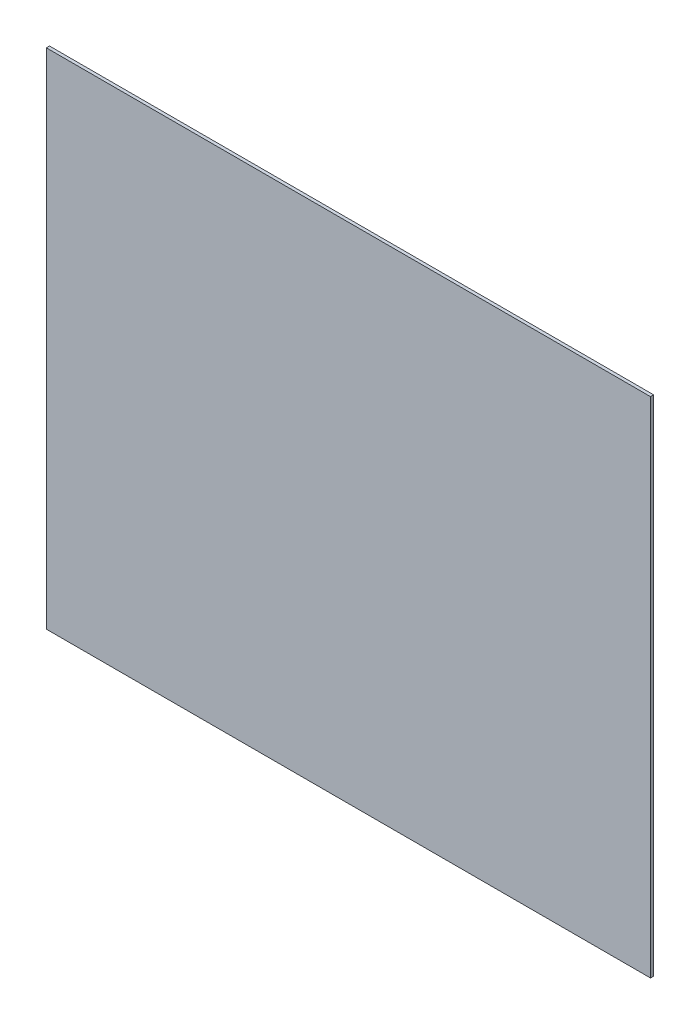
ISO-10303-21;
HEADER;
FILE_DESCRIPTION(('STEP AP214'),'2;1');
FILE_NAME('part.step','',(''),(''),'','','');
FILE_SCHEMA(('AUTOMOTIVE_DESIGN { 1 0 10303 214 1 1 1 1 }'));
ENDSEC;
DATA;
#1=APPLICATION_CONTEXT('core data for automotive mechanical design processes');
#2=APPLICATION_PROTOCOL_DEFINITION('international standard','automotive_design',2000,#1);
#3=PRODUCT_CONTEXT('',#1,'mechanical');
#4=PRODUCT('Part','Part','',(#3));
#5=PRODUCT_RELATED_PRODUCT_CATEGORY('part','',(#4));
#6=PRODUCT_DEFINITION_FORMATION('','',#4);
#7=PRODUCT_DEFINITION_CONTEXT('part definition',#1,'design');
#8=PRODUCT_DEFINITION('design','',#6,#7);
#9=PRODUCT_DEFINITION_SHAPE('','',#8);
#10=(LENGTH_UNIT() NAMED_UNIT(*) SI_UNIT(.MILLI.,.METRE.));
#11=(NAMED_UNIT(*) PLANE_ANGLE_UNIT() SI_UNIT($,.RADIAN.));
#12=(NAMED_UNIT(*) SI_UNIT($,.STERADIAN.) SOLID_ANGLE_UNIT());
#13=UNCERTAINTY_MEASURE_WITH_UNIT(LENGTH_MEASURE(1.E-05),#10,'distance_accuracy_value','');
#14=(GEOMETRIC_REPRESENTATION_CONTEXT(3) GLOBAL_UNCERTAINTY_ASSIGNED_CONTEXT((#13)) GLOBAL_UNIT_ASSIGNED_CONTEXT((#10,
#11,#12)) REPRESENTATION_CONTEXT('',''));
#15=CARTESIAN_POINT('',(0.,0.,0.));
#16=DIRECTION('',(0.,0.,1.));
#17=DIRECTION('',(1.,0.,0.));
#18=AXIS2_PLACEMENT_3D('',#15,#16,#17);
#19=CARTESIAN_POINT('',(304.8,-254.,3.175));
#20=DIRECTION('',(-1.,0.,0.));
#21=DIRECTION('',(0.,0.,1.));
#22=AXIS2_PLACEMENT_3D('',#19,#20,#21);
#23=PLANE('',#22);
#24=DIRECTION('',(0.,1.,0.));
#25=VECTOR('',#24,1.);
#26=CARTESIAN_POINT('',(304.8,-254.,0.));
#27=LINE('',#26,#25);
#28=CARTESIAN_POINT('',(304.8,-254.,0.));
#29=VERTEX_POINT('',#28);
#30=CARTESIAN_POINT('',(304.8,254.,0.));
#31=VERTEX_POINT('',#30);
#32=EDGE_CURVE('E104',#29,#31,#27,.T.);
#33=ORIENTED_EDGE('',*,*,#32,.T.);
#34=DIRECTION('',(0.,0.,-1.));
#35=VECTOR('',#34,1.);
#36=CARTESIAN_POINT('',(304.8,254.,3.175));
#37=LINE('',#36,#35);
#38=CARTESIAN_POINT('',(304.8,254.,3.175));
#39=VERTEX_POINT('',#38);
#40=EDGE_CURVE('E11',#39,#31,#37,.T.);
#41=ORIENTED_EDGE('',*,*,#40,.F.);
#42=DIRECTION('',(0.,1.,0.));
#43=VECTOR('',#42,1.);
#44=CARTESIAN_POINT('',(304.8,-254.,3.175));
#45=LINE('',#44,#43);
#46=CARTESIAN_POINT('',(304.8,-254.,3.175));
#47=VERTEX_POINT('',#46);
#48=EDGE_CURVE('E92',#47,#39,#45,.T.);
#49=ORIENTED_EDGE('',*,*,#48,.F.);
#50=DIRECTION('',(0.,0.,-1.));
#51=VECTOR('',#50,1.);
#52=CARTESIAN_POINT('',(304.8,-254.,3.175));
#53=LINE('',#52,#51);
#54=EDGE_CURVE('E100',#47,#29,#53,.T.);
#55=ORIENTED_EDGE('',*,*,#54,.T.);
#56=EDGE_LOOP('',(#33,#41,#49,#55));
#57=FACE_BOUND('',#56,.T.);
#58=ADVANCED_FACE('F41',(#57),#23,.F.);
#59=CARTESIAN_POINT('',(-304.8,254.,3.175));
#60=DIRECTION('',(0.,-1.,0.));
#61=DIRECTION('',(0.,0.,-1.));
#62=AXIS2_PLACEMENT_3D('',#59,#60,#61);
#63=PLANE('',#62);
#64=DIRECTION('',(-1.,0.,0.));
#65=VECTOR('',#64,1.);
#66=CARTESIAN_POINT('',(-304.8,254.,0.));
#67=LINE('',#66,#65);
#68=CARTESIAN_POINT('',(-304.8,254.,0.));
#69=VERTEX_POINT('',#68);
#70=EDGE_CURVE('E96',#31,#69,#67,.T.);
#71=ORIENTED_EDGE('',*,*,#70,.T.);
#72=DIRECTION('',(0.,0.,-1.));
#73=VECTOR('',#72,1.);
#74=CARTESIAN_POINT('',(-304.8,254.,3.175));
#75=LINE('',#74,#73);
#76=CARTESIAN_POINT('',(-304.8,254.,3.175));
#77=VERTEX_POINT('',#76);
#78=EDGE_CURVE('E49',#77,#69,#75,.T.);
#79=ORIENTED_EDGE('',*,*,#78,.F.);
#80=DIRECTION('',(-1.,0.,0.));
#81=VECTOR('',#80,1.);
#82=CARTESIAN_POINT('',(-304.8,254.,3.175));
#83=LINE('',#82,#81);
#84=EDGE_CURVE('E87',#39,#77,#83,.T.);
#85=ORIENTED_EDGE('',*,*,#84,.F.);
#86=ORIENTED_EDGE('',*,*,#40,.T.);
#87=EDGE_LOOP('',(#71,#79,#85,#86));
#88=FACE_BOUND('',#87,.T.);
#89=ADVANCED_FACE('F95',(#88),#63,.F.);
#90=CARTESIAN_POINT('',(-304.8,-254.,3.175));
#91=DIRECTION('',(1.,0.,0.));
#92=DIRECTION('',(0.,0.,-1.));
#93=AXIS2_PLACEMENT_3D('',#90,#91,#92);
#94=PLANE('',#93);
#95=DIRECTION('',(0.,-1.,0.));
#96=VECTOR('',#95,1.);
#97=CARTESIAN_POINT('',(-304.8,-254.,0.));
#98=LINE('',#97,#96);
#99=CARTESIAN_POINT('',(-304.8,-254.,0.));
#100=VERTEX_POINT('',#99);
#101=EDGE_CURVE('E74',#69,#100,#98,.T.);
#102=ORIENTED_EDGE('',*,*,#101,.T.);
#103=DIRECTION('',(0.,0.,-1.));
#104=VECTOR('',#103,1.);
#105=CARTESIAN_POINT('',(-304.8,-254.,3.175));
#106=LINE('',#105,#104);
#107=CARTESIAN_POINT('',(-304.8,-254.,3.175));
#108=VERTEX_POINT('',#107);
#109=EDGE_CURVE('E97',#108,#100,#106,.T.);
#110=ORIENTED_EDGE('',*,*,#109,.F.);
#111=DIRECTION('',(0.,-1.,0.));
#112=VECTOR('',#111,1.);
#113=CARTESIAN_POINT('',(-304.8,-254.,3.175));
#114=LINE('',#113,#112);
#115=EDGE_CURVE('E90',#77,#108,#114,.T.);
#116=ORIENTED_EDGE('',*,*,#115,.F.);
#117=ORIENTED_EDGE('',*,*,#78,.T.);
#118=EDGE_LOOP('',(#102,#110,#116,#117));
#119=FACE_BOUND('',#118,.T.);
#120=ADVANCED_FACE('F98',(#119),#94,.F.);
#121=CARTESIAN_POINT('',(-304.8,-254.,3.175));
#122=DIRECTION('',(0.,1.,0.));
#123=DIRECTION('',(0.,0.,1.));
#124=AXIS2_PLACEMENT_3D('',#121,#122,#123);
#125=PLANE('',#124);
#126=DIRECTION('',(1.,0.,0.));
#127=VECTOR('',#126,1.);
#128=CARTESIAN_POINT('',(-304.8,-254.,0.));
#129=LINE('',#128,#127);
#130=EDGE_CURVE('E80',#100,#29,#129,.T.);
#131=ORIENTED_EDGE('',*,*,#130,.T.);
#132=ORIENTED_EDGE('',*,*,#54,.F.);
#133=DIRECTION('',(1.,0.,0.));
#134=VECTOR('',#133,1.);
#135=CARTESIAN_POINT('',(-304.8,-254.,3.175));
#136=LINE('',#135,#134);
#137=EDGE_CURVE('E57',#108,#47,#136,.T.);
#138=ORIENTED_EDGE('',*,*,#137,.F.);
#139=ORIENTED_EDGE('',*,*,#109,.T.);
#140=EDGE_LOOP('',(#131,#132,#138,#139));
#141=FACE_BOUND('',#140,.T.);
#142=ADVANCED_FACE('F111',(#141),#125,.F.);
#143=CARTESIAN_POINT('',(0.,0.,3.175));
#144=DIRECTION('',(0.,0.,-1.));
#145=DIRECTION('',(-1.,0.,0.));
#146=AXIS2_PLACEMENT_3D('',#143,#144,#145);
#147=PLANE('',#146);
#148=ORIENTED_EDGE('',*,*,#48,.T.);
#149=ORIENTED_EDGE('',*,*,#84,.T.);
#150=ORIENTED_EDGE('',*,*,#115,.T.);
#151=ORIENTED_EDGE('',*,*,#137,.T.);
#152=EDGE_LOOP('',(#148,#149,#150,#151));
#153=FACE_BOUND('',#152,.T.);
#154=ADVANCED_FACE('F88',(#153),#147,.F.);
#155=CARTESIAN_POINT('',(0.,0.,0.));
#156=DIRECTION('',(0.,0.,-1.));
#157=DIRECTION('',(-1.,0.,0.));
#158=AXIS2_PLACEMENT_3D('',#155,#156,#157);
#159=PLANE('',#158);
#160=ORIENTED_EDGE('',*,*,#32,.F.);
#161=ORIENTED_EDGE('',*,*,#130,.F.);
#162=ORIENTED_EDGE('',*,*,#101,.F.);
#163=ORIENTED_EDGE('',*,*,#70,.F.);
#164=EDGE_LOOP('',(#160,#161,#162,#163));
#165=FACE_BOUND('',#164,.T.);
#166=ADVANCED_FACE('F114',(#165),#159,.T.);
#167=CLOSED_SHELL('',(#58,#89,#120,#142,#154,#166));
#168=MANIFOLD_SOLID_BREP('B2',#167);
#169=ADVANCED_BREP_SHAPE_REPRESENTATION('',(#18,#168),#14);
#170=SHAPE_DEFINITION_REPRESENTATION(#9,#169);
ENDSEC;
END-ISO-10303-21;
